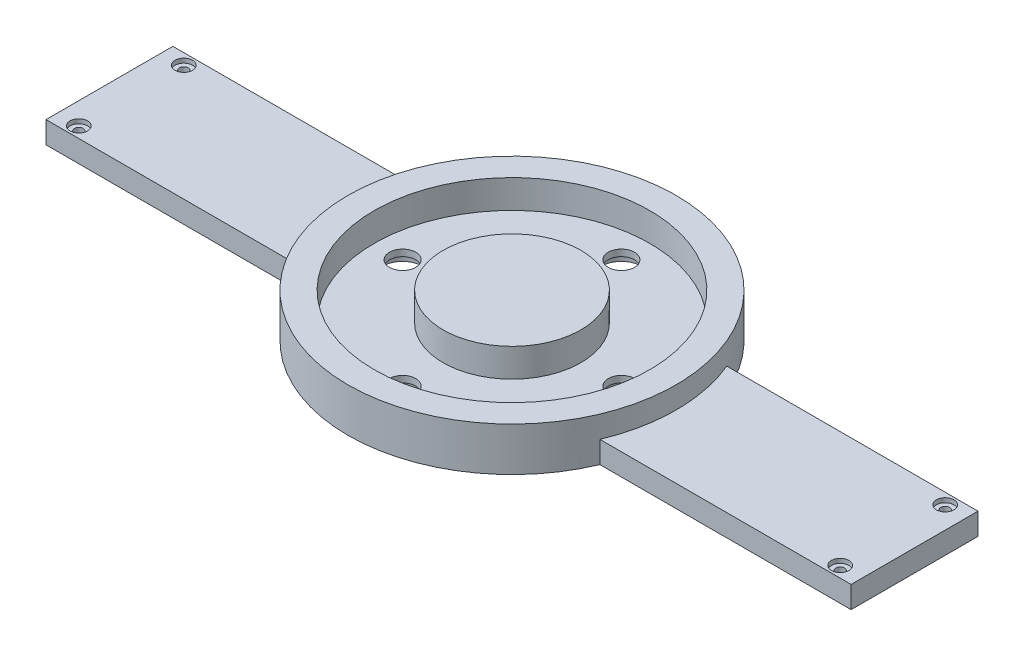
ISO-10303-21;
HEADER;
FILE_DESCRIPTION(('STEP AP214'),'2;1');
FILE_NAME('part.step','',(''),(''),'','','');
FILE_SCHEMA(('AUTOMOTIVE_DESIGN { 1 0 10303 214 1 1 1 1 }'));
ENDSEC;
DATA;
#1=APPLICATION_CONTEXT('core data for automotive mechanical design processes');
#2=APPLICATION_PROTOCOL_DEFINITION('international standard','automotive_design',2000,#1);
#3=PRODUCT_CONTEXT('',#1,'mechanical');
#4=PRODUCT('Part','Part','',(#3));
#5=PRODUCT_RELATED_PRODUCT_CATEGORY('part','',(#4));
#6=PRODUCT_DEFINITION_FORMATION('','',#4);
#7=PRODUCT_DEFINITION_CONTEXT('part definition',#1,'design');
#8=PRODUCT_DEFINITION('design','',#6,#7);
#9=PRODUCT_DEFINITION_SHAPE('','',#8);
#10=(LENGTH_UNIT() NAMED_UNIT(*) SI_UNIT(.MILLI.,.METRE.));
#11=(NAMED_UNIT(*) PLANE_ANGLE_UNIT() SI_UNIT($,.RADIAN.));
#12=(NAMED_UNIT(*) SI_UNIT($,.STERADIAN.) SOLID_ANGLE_UNIT());
#13=UNCERTAINTY_MEASURE_WITH_UNIT(LENGTH_MEASURE(1.E-05),#10,'distance_accuracy_value','');
#14=(GEOMETRIC_REPRESENTATION_CONTEXT(3) GLOBAL_UNCERTAINTY_ASSIGNED_CONTEXT((#13)) GLOBAL_UNIT_ASSIGNED_CONTEXT((#10,
#11,#12)) REPRESENTATION_CONTEXT('',''));
#15=CARTESIAN_POINT('',(0.,0.,0.));
#16=DIRECTION('',(0.,0.,1.));
#17=DIRECTION('',(1.,0.,0.));
#18=AXIS2_PLACEMENT_3D('',#15,#16,#17);
#19=CARTESIAN_POINT('',(-87.,5.,-12.));
#20=DIRECTION('',(0.,-1.,0.));
#21=DIRECTION('',(0.,0.,-1.));
#22=AXIS2_PLACEMENT_3D('',#19,#20,#21);
#23=CYLINDRICAL_SURFACE('',#22,0.999999999999998);
#24=CARTESIAN_POINT('',(-87.,0.,-12.));
#25=DIRECTION('',(0.,-1.,0.));
#26=DIRECTION('',(0.,0.,-1.));
#27=AXIS2_PLACEMENT_3D('',#24,#25,#26);
#28=CIRCLE('',#27,0.999999999999998);
#29=CARTESIAN_POINT('',(-87.,0.,-13.));
#30=VERTEX_POINT('',#29);
#31=EDGE_CURVE('E254',#30,#30,#28,.T.);
#32=ORIENTED_EDGE('',*,*,#31,.T.);
#33=EDGE_LOOP('',(#32));
#34=FACE_BOUND('',#33,.T.);
#35=CARTESIAN_POINT('',(-87.,4.,-12.));
#36=DIRECTION('',(0.,1.,0.));
#37=DIRECTION('',(0.,0.,1.));
#38=AXIS2_PLACEMENT_3D('',#35,#36,#37);
#39=CIRCLE('',#38,0.999999999999998);
#40=CARTESIAN_POINT('',(-87.,4.,-11.));
#41=VERTEX_POINT('',#40);
#42=EDGE_CURVE('E45',#41,#41,#39,.F.);
#43=ORIENTED_EDGE('',*,*,#42,.F.);
#44=EDGE_LOOP('',(#43));
#45=FACE_BOUND('',#44,.T.);
#46=ADVANCED_FACE('F41',(#34,#45),#23,.F.);
#47=CARTESIAN_POINT('',(-87.,5.,12.));
#48=DIRECTION('',(0.,-1.,0.));
#49=DIRECTION('',(0.,0.,-1.));
#50=AXIS2_PLACEMENT_3D('',#47,#48,#49);
#51=CYLINDRICAL_SURFACE('',#50,0.999999999999998);
#52=CARTESIAN_POINT('',(-87.,0.,12.));
#53=DIRECTION('',(0.,-1.,0.));
#54=DIRECTION('',(0.,0.,-1.));
#55=AXIS2_PLACEMENT_3D('',#52,#53,#54);
#56=CIRCLE('',#55,0.999999999999998);
#57=CARTESIAN_POINT('',(-87.,0.,11.));
#58=VERTEX_POINT('',#57);
#59=EDGE_CURVE('E285',#58,#58,#56,.T.);
#60=ORIENTED_EDGE('',*,*,#59,.T.);
#61=EDGE_LOOP('',(#60));
#62=FACE_BOUND('',#61,.T.);
#63=CARTESIAN_POINT('',(-87.,4.,12.));
#64=DIRECTION('',(0.,1.,0.));
#65=DIRECTION('',(0.,0.,1.));
#66=AXIS2_PLACEMENT_3D('',#63,#64,#65);
#67=CIRCLE('',#66,0.999999999999998);
#68=CARTESIAN_POINT('',(-87.,4.,13.));
#69=VERTEX_POINT('',#68);
#70=EDGE_CURVE('E259',#69,#69,#67,.F.);
#71=ORIENTED_EDGE('',*,*,#70,.F.);
#72=EDGE_LOOP('',(#71));
#73=FACE_BOUND('',#72,.T.);
#74=ADVANCED_FACE('F366',(#62,#73),#51,.F.);
#75=CARTESIAN_POINT('',(87.,5.,-12.));
#76=DIRECTION('',(0.,-1.,0.));
#77=DIRECTION('',(0.,0.,-1.));
#78=AXIS2_PLACEMENT_3D('',#75,#76,#77);
#79=CYLINDRICAL_SURFACE('',#78,0.999999999999998);
#80=CARTESIAN_POINT('',(87.,0.,-12.));
#81=DIRECTION('',(0.,-1.,0.));
#82=DIRECTION('',(0.,0.,-1.));
#83=AXIS2_PLACEMENT_3D('',#80,#81,#82);
#84=CIRCLE('',#83,0.999999999999998);
#85=CARTESIAN_POINT('',(87.,0.,-13.));
#86=VERTEX_POINT('',#85);
#87=EDGE_CURVE('E280',#86,#86,#84,.T.);
#88=ORIENTED_EDGE('',*,*,#87,.T.);
#89=EDGE_LOOP('',(#88));
#90=FACE_BOUND('',#89,.T.);
#91=CARTESIAN_POINT('',(87.,4.,-12.));
#92=DIRECTION('',(0.,1.,0.));
#93=DIRECTION('',(0.,0.,1.));
#94=AXIS2_PLACEMENT_3D('',#91,#92,#93);
#95=CIRCLE('',#94,0.999999999999998);
#96=CARTESIAN_POINT('',(87.,4.,-11.));
#97=VERTEX_POINT('',#96);
#98=EDGE_CURVE('E256',#97,#97,#95,.F.);
#99=ORIENTED_EDGE('',*,*,#98,.F.);
#100=EDGE_LOOP('',(#99));
#101=FACE_BOUND('',#100,.T.);
#102=ADVANCED_FACE('F372',(#90,#101),#79,.F.);
#103=CARTESIAN_POINT('',(87.,5.,12.));
#104=DIRECTION('',(0.,-1.,0.));
#105=DIRECTION('',(0.,0.,-1.));
#106=AXIS2_PLACEMENT_3D('',#103,#104,#105);
#107=CYLINDRICAL_SURFACE('',#106,0.999999999999998);
#108=CARTESIAN_POINT('',(87.,0.,12.));
#109=DIRECTION('',(0.,-1.,0.));
#110=DIRECTION('',(0.,0.,-1.));
#111=AXIS2_PLACEMENT_3D('',#108,#109,#110);
#112=CIRCLE('',#111,0.999999999999998);
#113=CARTESIAN_POINT('',(87.,0.,11.));
#114=VERTEX_POINT('',#113);
#115=EDGE_CURVE('E284',#114,#114,#112,.T.);
#116=ORIENTED_EDGE('',*,*,#115,.T.);
#117=EDGE_LOOP('',(#116));
#118=FACE_BOUND('',#117,.T.);
#119=CARTESIAN_POINT('',(87.,4.,12.));
#120=DIRECTION('',(0.,1.,0.));
#121=DIRECTION('',(0.,0.,1.));
#122=AXIS2_PLACEMENT_3D('',#119,#120,#121);
#123=CIRCLE('',#122,0.999999999999998);
#124=CARTESIAN_POINT('',(87.,4.,13.));
#125=VERTEX_POINT('',#124);
#126=EDGE_CURVE('E250',#125,#125,#123,.F.);
#127=ORIENTED_EDGE('',*,*,#126,.F.);
#128=EDGE_LOOP('',(#127));
#129=FACE_BOUND('',#128,.T.);
#130=ADVANCED_FACE('F378',(#118,#129),#107,.F.);
#131=CARTESIAN_POINT('',(0.,3.5,25.));
#132=DIRECTION('',(0.,-1.,0.));
#133=DIRECTION('',(0.,0.,-1.));
#134=AXIS2_PLACEMENT_3D('',#131,#132,#133);
#135=CYLINDRICAL_SURFACE('',#134,3.);
#136=CARTESIAN_POINT('',(0.,3.5,25.));
#137=DIRECTION('',(0.,-1.,0.));
#138=DIRECTION('',(0.,0.,-1.));
#139=AXIS2_PLACEMENT_3D('',#136,#137,#138);
#140=CIRCLE('',#139,3.);
#141=CARTESIAN_POINT('',(0.,3.5,22.));
#142=VERTEX_POINT('',#141);
#143=EDGE_CURVE('E202',#142,#142,#140,.T.);
#144=ORIENTED_EDGE('',*,*,#143,.F.);
#145=EDGE_LOOP('',(#144));
#146=FACE_BOUND('',#145,.T.);
#147=CARTESIAN_POINT('',(0.,2.,25.));
#148=DIRECTION('',(0.,-1.,0.));
#149=DIRECTION('',(0.,0.,-1.));
#150=AXIS2_PLACEMENT_3D('',#147,#148,#149);
#151=CIRCLE('',#150,3.);
#152=CARTESIAN_POINT('',(0.,2.,22.));
#153=VERTEX_POINT('',#152);
#154=EDGE_CURVE('E245',#153,#153,#151,.F.);
#155=ORIENTED_EDGE('',*,*,#154,.F.);
#156=EDGE_LOOP('',(#155));
#157=FACE_BOUND('',#156,.T.);
#158=ADVANCED_FACE('F381',(#146,#157),#135,.F.);
#159=CARTESIAN_POINT('',(-25.,3.5,2.61861100413235E-13));
#160=DIRECTION('',(0.,-1.,0.));
#161=DIRECTION('',(0.,0.,-1.));
#162=AXIS2_PLACEMENT_3D('',#159,#160,#161);
#163=CYLINDRICAL_SURFACE('',#162,3.);
#164=CARTESIAN_POINT('',(-25.,3.5,2.61861100413235E-13));
#165=DIRECTION('',(0.,-1.,0.));
#166=DIRECTION('',(1.,0.,0.));
#167=AXIS2_PLACEMENT_3D('',#164,#165,#166);
#168=CIRCLE('',#167,3.);
#169=CARTESIAN_POINT('',(-22.,3.5,2.30437768363647E-13));
#170=VERTEX_POINT('',#169);
#171=EDGE_CURVE('E188',#170,#170,#168,.T.);
#172=ORIENTED_EDGE('',*,*,#171,.F.);
#173=EDGE_LOOP('',(#172));
#174=FACE_BOUND('',#173,.T.);
#175=CARTESIAN_POINT('',(-25.,2.,2.61861100413235E-13));
#176=DIRECTION('',(0.,-1.,0.));
#177=DIRECTION('',(0.,0.,-1.));
#178=AXIS2_PLACEMENT_3D('',#175,#176,#177);
#179=CIRCLE('',#178,3.);
#180=CARTESIAN_POINT('',(-25.,2.,-2.99999999999974));
#181=VERTEX_POINT('',#180);
#182=EDGE_CURVE('E240',#181,#181,#179,.F.);
#183=ORIENTED_EDGE('',*,*,#182,.F.);
#184=EDGE_LOOP('',(#183));
#185=FACE_BOUND('',#184,.T.);
#186=ADVANCED_FACE('F583',(#174,#185),#163,.F.);
#187=CARTESIAN_POINT('',(0.,3.5,-25.));
#188=DIRECTION('',(0.,-1.,0.));
#189=DIRECTION('',(0.,0.,-1.));
#190=AXIS2_PLACEMENT_3D('',#187,#188,#189);
#191=CYLINDRICAL_SURFACE('',#190,3.);
#192=CARTESIAN_POINT('',(0.,3.5,-25.));
#193=DIRECTION('',(0.,-1.,0.));
#194=DIRECTION('',(0.,0.,1.));
#195=AXIS2_PLACEMENT_3D('',#192,#193,#194);
#196=CIRCLE('',#195,3.);
#197=CARTESIAN_POINT('',(0.,3.5,-22.));
#198=VERTEX_POINT('',#197);
#199=EDGE_CURVE('E203',#198,#198,#196,.T.);
#200=ORIENTED_EDGE('',*,*,#199,.F.);
#201=EDGE_LOOP('',(#200));
#202=FACE_BOUND('',#201,.T.);
#203=CARTESIAN_POINT('',(0.,2.,-25.));
#204=DIRECTION('',(0.,-1.,0.));
#205=DIRECTION('',(0.,0.,-1.));
#206=AXIS2_PLACEMENT_3D('',#203,#204,#205);
#207=CIRCLE('',#206,3.);
#208=CARTESIAN_POINT('',(0.,2.,-28.));
#209=VERTEX_POINT('',#208);
#210=EDGE_CURVE('E236',#209,#209,#207,.F.);
#211=ORIENTED_EDGE('',*,*,#210,.F.);
#212=EDGE_LOOP('',(#211));
#213=FACE_BOUND('',#212,.T.);
#214=ADVANCED_FACE('F592',(#202,#213),#191,.F.);
#215=CARTESIAN_POINT('',(25.,3.5,0.));
#216=DIRECTION('',(0.,-1.,0.));
#217=DIRECTION('',(0.,0.,-1.));
#218=AXIS2_PLACEMENT_3D('',#215,#216,#217);
#219=CYLINDRICAL_SURFACE('',#218,3.);
#220=CARTESIAN_POINT('',(25.,3.5,0.));
#221=DIRECTION('',(0.,-1.,0.));
#222=DIRECTION('',(-1.,0.,0.));
#223=AXIS2_PLACEMENT_3D('',#220,#221,#222);
#224=CIRCLE('',#223,3.);
#225=CARTESIAN_POINT('',(22.,3.5,0.));
#226=VERTEX_POINT('',#225);
#227=EDGE_CURVE('E198',#226,#226,#224,.T.);
#228=ORIENTED_EDGE('',*,*,#227,.F.);
#229=EDGE_LOOP('',(#228));
#230=FACE_BOUND('',#229,.T.);
#231=CARTESIAN_POINT('',(25.,2.,0.));
#232=DIRECTION('',(0.,-1.,0.));
#233=DIRECTION('',(0.,0.,-1.));
#234=AXIS2_PLACEMENT_3D('',#231,#232,#233);
#235=CIRCLE('',#234,3.);
#236=CARTESIAN_POINT('',(25.,2.,-3.00000000000009));
#237=VERTEX_POINT('',#236);
#238=EDGE_CURVE('E144',#237,#237,#235,.F.);
#239=ORIENTED_EDGE('',*,*,#238,.F.);
#240=EDGE_LOOP('',(#239));
#241=FACE_BOUND('',#240,.T.);
#242=ADVANCED_FACE('F599',(#230,#241),#219,.F.);
#243=CARTESIAN_POINT('',(0.,10.,0.));
#244=DIRECTION('',(0.,-1.,0.));
#245=DIRECTION('',(0.,0.,-1.));
#246=AXIS2_PLACEMENT_3D('',#243,#244,#245);
#247=CYLINDRICAL_SURFACE('',#246,37.5);
#248=CARTESIAN_POINT('',(0.,0.,0.));
#249=DIRECTION('',(0.,1.,0.));
#250=DIRECTION('',(0.,0.,1.));
#251=AXIS2_PLACEMENT_3D('',#248,#249,#250);
#252=CIRCLE('',#251,37.5);
#253=CARTESIAN_POINT('',(34.5832329315812,0.,-14.5));
#254=VERTEX_POINT('',#253);
#255=CARTESIAN_POINT('',(-34.5832329315812,0.,-14.5));
#256=VERTEX_POINT('',#255);
#257=EDGE_CURVE('E51',#254,#256,#252,.T.);
#258=ORIENTED_EDGE('',*,*,#257,.T.);
#259=DIRECTION('',(0.,-1.,0.));
#260=VECTOR('',#259,1.);
#261=CARTESIAN_POINT('',(-34.5832329315812,5.,-14.5));
#262=LINE('',#261,#260);
#263=CARTESIAN_POINT('',(-34.5832329315812,5.,-14.5));
#264=VERTEX_POINT('',#263);
#265=EDGE_CURVE('E59',#264,#256,#262,.T.);
#266=ORIENTED_EDGE('',*,*,#265,.F.);
#267=CARTESIAN_POINT('',(0.,5.,0.));
#268=DIRECTION('',(0.,1.,0.));
#269=DIRECTION('',(0.,0.,1.));
#270=AXIS2_PLACEMENT_3D('',#267,#268,#269);
#271=CIRCLE('',#270,37.5);
#272=CARTESIAN_POINT('',(-34.5832329315812,5.,14.5));
#273=VERTEX_POINT('',#272);
#274=EDGE_CURVE('E63',#264,#273,#271,.T.);
#275=ORIENTED_EDGE('',*,*,#274,.T.);
#276=DIRECTION('',(0.,-1.,0.));
#277=VECTOR('',#276,1.);
#278=CARTESIAN_POINT('',(-34.5832329315812,5.,14.5));
#279=LINE('',#278,#277);
#280=CARTESIAN_POINT('',(-34.5832329315812,0.,14.5));
#281=VERTEX_POINT('',#280);
#282=EDGE_CURVE('E121',#273,#281,#279,.T.);
#283=ORIENTED_EDGE('',*,*,#282,.T.);
#284=CARTESIAN_POINT('',(34.5832329315812,0.,14.5));
#285=VERTEX_POINT('',#284);
#286=EDGE_CURVE('E226',#281,#285,#252,.T.);
#287=ORIENTED_EDGE('',*,*,#286,.T.);
#288=DIRECTION('',(0.,-1.,0.));
#289=VECTOR('',#288,1.);
#290=CARTESIAN_POINT('',(34.5832329315812,5.,14.5));
#291=LINE('',#290,#289);
#292=CARTESIAN_POINT('',(34.5832329315812,5.,14.5));
#293=VERTEX_POINT('',#292);
#294=EDGE_CURVE('E184',#293,#285,#291,.T.);
#295=ORIENTED_EDGE('',*,*,#294,.F.);
#296=CARTESIAN_POINT('',(0.,5.,0.));
#297=DIRECTION('',(0.,1.,0.));
#298=DIRECTION('',(0.,0.,-1.));
#299=AXIS2_PLACEMENT_3D('',#296,#297,#298);
#300=CIRCLE('',#299,37.5);
#301=CARTESIAN_POINT('',(34.5832329315812,5.,-14.5));
#302=VERTEX_POINT('',#301);
#303=EDGE_CURVE('E157',#293,#302,#300,.T.);
#304=ORIENTED_EDGE('',*,*,#303,.T.);
#305=DIRECTION('',(0.,-1.,0.));
#306=VECTOR('',#305,1.);
#307=CARTESIAN_POINT('',(34.5832329315812,5.,-14.5));
#308=LINE('',#307,#306);
#309=EDGE_CURVE('E173',#302,#254,#308,.T.);
#310=ORIENTED_EDGE('',*,*,#309,.T.);
#311=EDGE_LOOP('',(#258,#266,#275,#283,#287,#295,#304,#310));
#312=FACE_BOUND('',#311,.T.);
#313=CARTESIAN_POINT('',(0.,10.,0.));
#314=DIRECTION('',(0.,1.,0.));
#315=DIRECTION('',(0.,0.,1.));
#316=AXIS2_PLACEMENT_3D('',#313,#314,#315);
#317=CIRCLE('',#316,37.5);
#318=CARTESIAN_POINT('',(0.,10.,37.5));
#319=VERTEX_POINT('',#318);
#320=EDGE_CURVE('E11',#319,#319,#317,.T.);
#321=ORIENTED_EDGE('',*,*,#320,.F.);
#322=EDGE_LOOP('',(#321));
#323=FACE_BOUND('',#322,.T.);
#324=ADVANCED_FACE('F43',(#312,#323),#247,.T.);
#325=CARTESIAN_POINT('',(0.,10.,0.));
#326=DIRECTION('',(0.,1.,0.));
#327=DIRECTION('',(0.,0.,1.));
#328=AXIS2_PLACEMENT_3D('',#325,#326,#327);
#329=PLANE('',#328);
#330=CARTESIAN_POINT('',(0.,10.,0.));
#331=DIRECTION('',(0.,1.,0.));
#332=DIRECTION('',(0.,0.,1.));
#333=AXIS2_PLACEMENT_3D('',#330,#331,#332);
#334=CIRCLE('',#333,31.5);
#335=CARTESIAN_POINT('',(0.,10.,31.5));
#336=VERTEX_POINT('',#335);
#337=EDGE_CURVE('E218',#336,#336,#334,.T.);
#338=ORIENTED_EDGE('',*,*,#337,.F.);
#339=EDGE_LOOP('',(#338));
#340=FACE_BOUND('',#339,.T.);
#341=ORIENTED_EDGE('',*,*,#320,.T.);
#342=EDGE_LOOP('',(#341));
#343=FACE_BOUND('',#342,.T.);
#344=ADVANCED_FACE('F330',(#340,#343),#329,.T.);
#345=CARTESIAN_POINT('',(0.,0.,0.));
#346=DIRECTION('',(0.,1.,0.));
#347=DIRECTION('',(0.,0.,1.));
#348=AXIS2_PLACEMENT_3D('',#345,#346,#347);
#349=PLANE('',#348);
#350=ORIENTED_EDGE('',*,*,#87,.F.);
#351=EDGE_LOOP('',(#350));
#352=FACE_BOUND('',#351,.T.);
#353=ORIENTED_EDGE('',*,*,#59,.F.);
#354=EDGE_LOOP('',(#353));
#355=FACE_BOUND('',#354,.T.);
#356=ORIENTED_EDGE('',*,*,#31,.F.);
#357=EDGE_LOOP('',(#356));
#358=FACE_BOUND('',#357,.T.);
#359=ORIENTED_EDGE('',*,*,#115,.F.);
#360=EDGE_LOOP('',(#359));
#361=FACE_BOUND('',#360,.T.);
#362=CARTESIAN_POINT('',(-1.74574066942157E-13,0.,-25.));
#363=DIRECTION('',(0.,-1.,0.));
#364=DIRECTION('',(-1.,0.,0.));
#365=AXIS2_PLACEMENT_3D('',#362,#363,#364);
#366=CIRCLE('',#365,4.5);
#367=CARTESIAN_POINT('',(-4.50000000000018,0.,-25.));
#368=VERTEX_POINT('',#367);
#369=EDGE_CURVE('E299',#368,#368,#366,.T.);
#370=ORIENTED_EDGE('',*,*,#369,.F.);
#371=EDGE_LOOP('',(#370));
#372=FACE_BOUND('',#371,.T.);
#373=CARTESIAN_POINT('',(-25.,0.,0.));
#374=DIRECTION('',(0.,-1.,0.));
#375=DIRECTION('',(0.,0.,1.));
#376=AXIS2_PLACEMENT_3D('',#373,#374,#375);
#377=CIRCLE('',#376,4.5);
#378=CARTESIAN_POINT('',(-25.,0.,4.50000000000009));
#379=VERTEX_POINT('',#378);
#380=EDGE_CURVE('E307',#379,#379,#377,.T.);
#381=ORIENTED_EDGE('',*,*,#380,.F.);
#382=EDGE_LOOP('',(#381));
#383=FACE_BOUND('',#382,.T.);
#384=CARTESIAN_POINT('',(3.49148133884313E-13,0.,25.));
#385=DIRECTION('',(0.,-1.,0.));
#386=DIRECTION('',(1.,0.,0.));
#387=AXIS2_PLACEMENT_3D('',#384,#385,#386);
#388=CIRCLE('',#387,4.5);
#389=CARTESIAN_POINT('',(4.50000000000035,0.,25.));
#390=VERTEX_POINT('',#389);
#391=EDGE_CURVE('E295',#390,#390,#388,.T.);
#392=ORIENTED_EDGE('',*,*,#391,.F.);
#393=EDGE_LOOP('',(#392));
#394=FACE_BOUND('',#393,.T.);
#395=CARTESIAN_POINT('',(25.,0.,0.));
#396=DIRECTION('',(0.,-1.,0.));
#397=DIRECTION('',(0.,0.,-1.));
#398=AXIS2_PLACEMENT_3D('',#395,#396,#397);
#399=CIRCLE('',#398,4.5);
#400=CARTESIAN_POINT('',(25.,0.,-4.50000000000009));
#401=VERTEX_POINT('',#400);
#402=EDGE_CURVE('E249',#401,#401,#399,.T.);
#403=ORIENTED_EDGE('',*,*,#402,.F.);
#404=EDGE_LOOP('',(#403));
#405=FACE_BOUND('',#404,.T.);
#406=ORIENTED_EDGE('',*,*,#257,.F.);
#407=DIRECTION('',(1.,0.,0.));
#408=VECTOR('',#407,1.);
#409=CARTESIAN_POINT('',(34.5832329315812,0.,-14.5));
#410=LINE('',#409,#408);
#411=CARTESIAN_POINT('',(92.0000000015812,0.,-14.5));
#412=VERTEX_POINT('',#411);
#413=EDGE_CURVE('E152',#254,#412,#410,.T.);
#414=ORIENTED_EDGE('',*,*,#413,.T.);
#415=DIRECTION('',(0.,0.,1.));
#416=VECTOR('',#415,1.);
#417=CARTESIAN_POINT('',(92.0000000015812,0.,-14.5));
#418=LINE('',#417,#416);
#419=CARTESIAN_POINT('',(92.0000000015812,0.,14.5));
#420=VERTEX_POINT('',#419);
#421=EDGE_CURVE('E177',#412,#420,#418,.T.);
#422=ORIENTED_EDGE('',*,*,#421,.T.);
#423=DIRECTION('',(-1.,0.,0.));
#424=VECTOR('',#423,1.);
#425=CARTESIAN_POINT('',(34.5832329315812,0.,14.5));
#426=LINE('',#425,#424);
#427=EDGE_CURVE('E161',#420,#285,#426,.T.);
#428=ORIENTED_EDGE('',*,*,#427,.T.);
#429=ORIENTED_EDGE('',*,*,#286,.F.);
#430=DIRECTION('',(-1.,0.,0.));
#431=VECTOR('',#430,1.);
#432=CARTESIAN_POINT('',(-34.5832329315812,0.,14.5));
#433=LINE('',#432,#431);
#434=CARTESIAN_POINT('',(-92.0000000015812,0.,14.5));
#435=VERTEX_POINT('',#434);
#436=EDGE_CURVE('E141',#281,#435,#433,.T.);
#437=ORIENTED_EDGE('',*,*,#436,.T.);
#438=DIRECTION('',(0.,0.,-1.));
#439=VECTOR('',#438,1.);
#440=CARTESIAN_POINT('',(-92.0000000015812,0.,14.5));
#441=LINE('',#440,#439);
#442=CARTESIAN_POINT('',(-92.0000000015812,0.,-14.5));
#443=VERTEX_POINT('',#442);
#444=EDGE_CURVE('E114',#435,#443,#441,.T.);
#445=ORIENTED_EDGE('',*,*,#444,.T.);
#446=DIRECTION('',(1.,0.,0.));
#447=VECTOR('',#446,1.);
#448=CARTESIAN_POINT('',(-34.5832329315812,0.,-14.5));
#449=LINE('',#448,#447);
#450=EDGE_CURVE('E135',#443,#256,#449,.T.);
#451=ORIENTED_EDGE('',*,*,#450,.T.);
#452=EDGE_LOOP('',(#406,#414,#422,#428,#429,#437,#445,#451));
#453=FACE_BOUND('',#452,.T.);
#454=ADVANCED_FACE('F326',(#352,#355,#358,#361,#372,#383,#394,#405,#453),#349,.F.);
#455=CARTESIAN_POINT('',(0.,3.5,0.));
#456=DIRECTION('',(0.,1.,0.));
#457=DIRECTION('',(0.,0.,1.));
#458=AXIS2_PLACEMENT_3D('',#455,#456,#457);
#459=CYLINDRICAL_SURFACE('',#458,31.5);
#460=CARTESIAN_POINT('',(0.,3.5,0.));
#461=DIRECTION('',(0.,1.,0.));
#462=DIRECTION('',(0.,0.,1.));
#463=AXIS2_PLACEMENT_3D('',#460,#461,#462);
#464=CIRCLE('',#463,31.5);
#465=CARTESIAN_POINT('',(0.,3.5,31.5));
#466=VERTEX_POINT('',#465);
#467=EDGE_CURVE('E222',#466,#466,#464,.T.);
#468=CARTESIAN_POINT('',(0.,3.5,31.5));
#469=CARTESIAN_POINT('',(0.,3.56770833333333,31.5));
#470=CARTESIAN_POINT('',(0.,3.63541666666667,31.5));
#471=CARTESIAN_POINT('',(0.,3.77083333333333,31.5));
#472=CARTESIAN_POINT('',(0.,3.83854166666667,31.5));
#473=CARTESIAN_POINT('',(0.,3.97395833333333,31.5));
#474=CARTESIAN_POINT('',(0.,4.04166666666667,31.5));
#475=CARTESIAN_POINT('',(0.,4.17708333333333,31.5));
#476=CARTESIAN_POINT('',(0.,4.24479166666667,31.5));
#477=CARTESIAN_POINT('',(0.,4.38020833333333,31.5));
#478=CARTESIAN_POINT('',(0.,4.44791666666667,31.5));
#479=CARTESIAN_POINT('',(0.,4.58333333333333,31.5));
#480=CARTESIAN_POINT('',(0.,4.65104166666667,31.5));
#481=CARTESIAN_POINT('',(0.,4.78645833333333,31.5));
#482=CARTESIAN_POINT('',(0.,4.85416666666667,31.5));
#483=CARTESIAN_POINT('',(0.,4.98958333333333,31.5));
#484=CARTESIAN_POINT('',(0.,5.05729166666667,31.5));
#485=CARTESIAN_POINT('',(0.,5.19270833333333,31.5));
#486=CARTESIAN_POINT('',(0.,5.26041666666667,31.5));
#487=CARTESIAN_POINT('',(0.,5.39583333333333,31.5));
#488=CARTESIAN_POINT('',(0.,5.46354166666667,31.5));
#489=CARTESIAN_POINT('',(0.,5.59895833333333,31.5));
#490=CARTESIAN_POINT('',(0.,5.66666666666667,31.5));
#491=CARTESIAN_POINT('',(0.,5.80208333333333,31.5));
#492=CARTESIAN_POINT('',(0.,5.86979166666667,31.5));
#493=CARTESIAN_POINT('',(0.,6.00520833333333,31.5));
#494=CARTESIAN_POINT('',(0.,6.07291666666667,31.5));
#495=CARTESIAN_POINT('',(0.,6.20833333333333,31.5));
#496=CARTESIAN_POINT('',(0.,6.27604166666667,31.5));
#497=CARTESIAN_POINT('',(0.,6.41145833333333,31.5));
#498=CARTESIAN_POINT('',(0.,6.47916666666667,31.5));
#499=CARTESIAN_POINT('',(0.,6.61458333333333,31.5));
#500=CARTESIAN_POINT('',(0.,6.68229166666667,31.5));
#501=CARTESIAN_POINT('',(0.,6.81770833333333,31.5));
#502=CARTESIAN_POINT('',(0.,6.88541666666667,31.5));
#503=CARTESIAN_POINT('',(0.,7.02083333333333,31.5));
#504=CARTESIAN_POINT('',(0.,7.08854166666667,31.5));
#505=CARTESIAN_POINT('',(0.,7.22395833333333,31.5));
#506=CARTESIAN_POINT('',(0.,7.29166666666667,31.5));
#507=CARTESIAN_POINT('',(0.,7.42708333333333,31.5));
#508=CARTESIAN_POINT('',(0.,7.49479166666667,31.5));
#509=CARTESIAN_POINT('',(0.,7.63020833333333,31.5));
#510=CARTESIAN_POINT('',(0.,7.69791666666667,31.5));
#511=CARTESIAN_POINT('',(0.,7.83333333333333,31.5));
#512=CARTESIAN_POINT('',(0.,7.90104166666667,31.5));
#513=CARTESIAN_POINT('',(0.,8.03645833333333,31.5));
#514=CARTESIAN_POINT('',(0.,8.10416666666667,31.5));
#515=CARTESIAN_POINT('',(0.,8.23958333333333,31.5));
#516=CARTESIAN_POINT('',(0.,8.30729166666667,31.5));
#517=CARTESIAN_POINT('',(0.,8.44270833333333,31.5));
#518=CARTESIAN_POINT('',(0.,8.51041666666667,31.5));
#519=CARTESIAN_POINT('',(0.,8.64583333333333,31.5));
#520=CARTESIAN_POINT('',(0.,8.71354166666667,31.5));
#521=CARTESIAN_POINT('',(0.,8.84895833333333,31.5));
#522=CARTESIAN_POINT('',(0.,8.91666666666667,31.5));
#523=CARTESIAN_POINT('',(0.,9.05208333333333,31.5));
#524=CARTESIAN_POINT('',(0.,9.11979166666667,31.5));
#525=CARTESIAN_POINT('',(0.,9.25520833333333,31.5));
#526=CARTESIAN_POINT('',(0.,9.32291666666667,31.5));
#527=CARTESIAN_POINT('',(0.,9.45833333333333,31.5));
#528=CARTESIAN_POINT('',(0.,9.52604166666667,31.5));
#529=CARTESIAN_POINT('',(0.,9.66145833333333,31.5));
#530=CARTESIAN_POINT('',(0.,9.72916666666667,31.5));
#531=CARTESIAN_POINT('',(0.,9.86458333333333,31.5));
#532=CARTESIAN_POINT('',(0.,9.93229166666667,31.5));
#533=CARTESIAN_POINT('',(0.,10.,31.5));
#534=B_SPLINE_CURVE_WITH_KNOTS('',3,(#468,#469,#470,#471,#472,#473,#474,#475,#476,#477,#478,
#479,#480,#481,#482,#483,#484,#485,#486,#487,#488,#489,#490,#491,#492,#493,#494,#495,#496,#497,
#498,#499,#500,#501,#502,#503,#504,#505,#506,#507,#508,#509,#510,#511,#512,#513,#514,#515,#516,
#517,#518,#519,#520,#521,#522,#523,#524,#525,#526,#527,#528,#529,#530,#531,#532,#533),
.UNSPECIFIED.,.F.,.F.,(4,2,2,2,2,2,2,2,2,2,2,2,2,2,2,2,2,2,2,2,2,2,2,2,2,2,2,2,2,2,2,2,4),(0.,
0.203125,0.40625,0.609375,0.8125,1.015625,1.21875,1.421875,1.625,1.828125,2.03125,2.234375,
2.4375,2.640625,2.84375,3.046875,3.25,3.453125,3.65625,3.859375,4.0625,4.265625,4.46875,
4.671875,4.875,5.078125,5.28125,5.484375,5.6875,5.890625,6.09375,6.296875,6.5),.UNSPECIFIED.);
#535=EDGE_CURVE('BSEAM329',#466,#336,#534,.T.);
#536=ORIENTED_EDGE('',*,*,#467,.F.);
#537=ORIENTED_EDGE('',*,*,#337,.T.);
#538=ORIENTED_EDGE('',*,*,#535,.T.);
#539=ORIENTED_EDGE('',*,*,#535,.F.);
#540=EDGE_LOOP('',(#536,#538,#537,#539));
#541=FACE_BOUND('',#540,.T.);
#542=ADVANCED_FACE('F329',(#541),#459,.F.);
#543=CARTESIAN_POINT('',(0.,3.5,0.));
#544=DIRECTION('',(0.,1.,0.));
#545=DIRECTION('',(0.,0.,1.));
#546=AXIS2_PLACEMENT_3D('',#543,#544,#545);
#547=PLANE('',#546);
#548=ORIENTED_EDGE('',*,*,#227,.T.);
#549=EDGE_LOOP('',(#548));
#550=FACE_BOUND('',#549,.T.);
#551=ORIENTED_EDGE('',*,*,#199,.T.);
#552=EDGE_LOOP('',(#551));
#553=FACE_BOUND('',#552,.T.);
#554=ORIENTED_EDGE('',*,*,#171,.T.);
#555=EDGE_LOOP('',(#554));
#556=FACE_BOUND('',#555,.T.);
#557=ORIENTED_EDGE('',*,*,#143,.T.);
#558=EDGE_LOOP('',(#557));
#559=FACE_BOUND('',#558,.T.);
#560=CARTESIAN_POINT('',(0.,3.5,0.));
#561=DIRECTION('',(0.,1.,0.));
#562=DIRECTION('',(0.,0.,1.));
#563=AXIS2_PLACEMENT_3D('',#560,#561,#562);
#564=CIRCLE('',#563,15.75);
#565=CARTESIAN_POINT('',(0.,3.5,-15.75));
#566=VERTEX_POINT('',#565);
#567=EDGE_CURVE('E213',#566,#566,#564,.T.);
#568=ORIENTED_EDGE('',*,*,#567,.F.);
#569=EDGE_LOOP('',(#568));
#570=FACE_BOUND('',#569,.T.);
#571=ORIENTED_EDGE('',*,*,#467,.T.);
#572=EDGE_LOOP('',(#571));
#573=FACE_BOUND('',#572,.T.);
#574=ADVANCED_FACE('F663',(#550,#553,#556,#559,#570,#573),#547,.T.);
#575=CARTESIAN_POINT('',(0.,10.,0.));
#576=DIRECTION('',(0.,-1.,0.));
#577=DIRECTION('',(0.,0.,-1.));
#578=AXIS2_PLACEMENT_3D('',#575,#576,#577);
#579=CYLINDRICAL_SURFACE('',#578,15.75);
#580=CARTESIAN_POINT('',(0.,10.,0.));
#581=DIRECTION('',(0.,1.,0.));
#582=DIRECTION('',(0.,0.,1.));
#583=AXIS2_PLACEMENT_3D('',#580,#581,#582);
#584=CIRCLE('',#583,15.75);
#585=CARTESIAN_POINT('',(0.,10.,-15.75));
#586=VERTEX_POINT('',#585);
#587=EDGE_CURVE('E214',#586,#586,#584,.T.);
#588=CARTESIAN_POINT('',(0.,10.,-15.75));
#589=CARTESIAN_POINT('',(0.,9.93229166666667,-15.75));
#590=CARTESIAN_POINT('',(0.,9.86458333333333,-15.75));
#591=CARTESIAN_POINT('',(0.,9.72916666666667,-15.75));
#592=CARTESIAN_POINT('',(0.,9.66145833333333,-15.75));
#593=CARTESIAN_POINT('',(0.,9.52604166666667,-15.75));
#594=CARTESIAN_POINT('',(0.,9.45833333333333,-15.75));
#595=CARTESIAN_POINT('',(0.,9.32291666666667,-15.75));
#596=CARTESIAN_POINT('',(0.,9.25520833333333,-15.75));
#597=CARTESIAN_POINT('',(0.,9.11979166666667,-15.75));
#598=CARTESIAN_POINT('',(0.,9.05208333333333,-15.75));
#599=CARTESIAN_POINT('',(0.,8.91666666666667,-15.75));
#600=CARTESIAN_POINT('',(0.,8.84895833333333,-15.75));
#601=CARTESIAN_POINT('',(0.,8.71354166666667,-15.75));
#602=CARTESIAN_POINT('',(0.,8.64583333333333,-15.75));
#603=CARTESIAN_POINT('',(0.,8.51041666666667,-15.75));
#604=CARTESIAN_POINT('',(0.,8.44270833333333,-15.75));
#605=CARTESIAN_POINT('',(0.,8.30729166666667,-15.75));
#606=CARTESIAN_POINT('',(0.,8.23958333333333,-15.75));
#607=CARTESIAN_POINT('',(0.,8.10416666666667,-15.75));
#608=CARTESIAN_POINT('',(0.,8.03645833333333,-15.75));
#609=CARTESIAN_POINT('',(0.,7.90104166666667,-15.75));
#610=CARTESIAN_POINT('',(0.,7.83333333333333,-15.75));
#611=CARTESIAN_POINT('',(0.,7.69791666666667,-15.75));
#612=CARTESIAN_POINT('',(0.,7.63020833333333,-15.75));
#613=CARTESIAN_POINT('',(0.,7.49479166666667,-15.75));
#614=CARTESIAN_POINT('',(0.,7.42708333333333,-15.75));
#615=CARTESIAN_POINT('',(0.,7.29166666666667,-15.75));
#616=CARTESIAN_POINT('',(0.,7.22395833333333,-15.75));
#617=CARTESIAN_POINT('',(0.,7.08854166666667,-15.75));
#618=CARTESIAN_POINT('',(0.,7.02083333333333,-15.75));
#619=CARTESIAN_POINT('',(0.,6.88541666666667,-15.75));
#620=CARTESIAN_POINT('',(0.,6.81770833333333,-15.75));
#621=CARTESIAN_POINT('',(0.,6.68229166666667,-15.75));
#622=CARTESIAN_POINT('',(0.,6.61458333333333,-15.75));
#623=CARTESIAN_POINT('',(0.,6.47916666666667,-15.75));
#624=CARTESIAN_POINT('',(0.,6.41145833333333,-15.75));
#625=CARTESIAN_POINT('',(0.,6.27604166666667,-15.75));
#626=CARTESIAN_POINT('',(0.,6.20833333333333,-15.75));
#627=CARTESIAN_POINT('',(0.,6.07291666666667,-15.75));
#628=CARTESIAN_POINT('',(0.,6.00520833333333,-15.75));
#629=CARTESIAN_POINT('',(0.,5.86979166666667,-15.75));
#630=CARTESIAN_POINT('',(0.,5.80208333333333,-15.75));
#631=CARTESIAN_POINT('',(0.,5.66666666666667,-15.75));
#632=CARTESIAN_POINT('',(0.,5.59895833333333,-15.75));
#633=CARTESIAN_POINT('',(0.,5.46354166666667,-15.75));
#634=CARTESIAN_POINT('',(0.,5.39583333333333,-15.75));
#635=CARTESIAN_POINT('',(0.,5.26041666666667,-15.75));
#636=CARTESIAN_POINT('',(0.,5.19270833333333,-15.75));
#637=CARTESIAN_POINT('',(0.,5.05729166666667,-15.75));
#638=CARTESIAN_POINT('',(0.,4.98958333333333,-15.75));
#639=CARTESIAN_POINT('',(0.,4.85416666666667,-15.75));
#640=CARTESIAN_POINT('',(0.,4.78645833333333,-15.75));
#641=CARTESIAN_POINT('',(0.,4.65104166666667,-15.75));
#642=CARTESIAN_POINT('',(0.,4.58333333333333,-15.75));
#643=CARTESIAN_POINT('',(0.,4.44791666666667,-15.75));
#644=CARTESIAN_POINT('',(0.,4.38020833333333,-15.75));
#645=CARTESIAN_POINT('',(0.,4.24479166666667,-15.75));
#646=CARTESIAN_POINT('',(0.,4.17708333333333,-15.75));
#647=CARTESIAN_POINT('',(0.,4.04166666666667,-15.75));
#648=CARTESIAN_POINT('',(0.,3.97395833333333,-15.75));
#649=CARTESIAN_POINT('',(0.,3.83854166666667,-15.75));
#650=CARTESIAN_POINT('',(0.,3.77083333333333,-15.75));
#651=CARTESIAN_POINT('',(0.,3.63541666666667,-15.75));
#652=CARTESIAN_POINT('',(0.,3.56770833333333,-15.75));
#653=CARTESIAN_POINT('',(0.,3.5,-15.75));
#654=B_SPLINE_CURVE_WITH_KNOTS('',3,(#588,#589,#590,#591,#592,#593,#594,#595,#596,#597,#598,
#599,#600,#601,#602,#603,#604,#605,#606,#607,#608,#609,#610,#611,#612,#613,#614,#615,#616,#617,
#618,#619,#620,#621,#622,#623,#624,#625,#626,#627,#628,#629,#630,#631,#632,#633,#634,#635,#636,
#637,#638,#639,#640,#641,#642,#643,#644,#645,#646,#647,#648,#649,#650,#651,#652,#653),
.UNSPECIFIED.,.F.,.F.,(4,2,2,2,2,2,2,2,2,2,2,2,2,2,2,2,2,2,2,2,2,2,2,2,2,2,2,2,2,2,2,2,4),(0.,
0.203125,0.40625,0.609375000000001,0.812500000000001,1.015625,1.21875,1.421875,1.625,1.828125,
2.03125,2.234375,2.4375,2.640625,2.84375,3.046875,3.25,3.453125,3.65625,3.859375,4.0625,
4.265625,4.46875,4.671875,4.875,5.078125,5.28125,5.484375,5.6875,5.890625,6.09375,6.296875,6.5),.UNSPECIFIED.);
#655=EDGE_CURVE('BSEAM668',#586,#566,#654,.T.);
#656=ORIENTED_EDGE('',*,*,#587,.F.);
#657=ORIENTED_EDGE('',*,*,#567,.T.);
#658=ORIENTED_EDGE('',*,*,#655,.T.);
#659=ORIENTED_EDGE('',*,*,#655,.F.);
#660=EDGE_LOOP('',(#656,#658,#657,#659));
#661=FACE_BOUND('',#660,.T.);
#662=ADVANCED_FACE('F668',(#661),#579,.T.);
#663=CARTESIAN_POINT('',(0.,10.,0.));
#664=DIRECTION('',(0.,1.,0.));
#665=DIRECTION('',(0.,0.,1.));
#666=AXIS2_PLACEMENT_3D('',#663,#664,#665);
#667=PLANE('',#666);
#668=ORIENTED_EDGE('',*,*,#587,.T.);
#669=EDGE_LOOP('',(#668));
#670=FACE_BOUND('',#669,.T.);
#671=ADVANCED_FACE('F658',(#670),#667,.T.);
#672=CARTESIAN_POINT('',(34.5832329315812,5.,14.5));
#673=DIRECTION('',(0.,0.,1.));
#674=DIRECTION('',(1.,0.,0.));
#675=AXIS2_PLACEMENT_3D('',#672,#673,#674);
#676=PLANE('',#675);
#677=ORIENTED_EDGE('',*,*,#427,.F.);
#678=DIRECTION('',(0.,-1.,0.));
#679=VECTOR('',#678,1.);
#680=CARTESIAN_POINT('',(92.0000000015812,5.,14.5));
#681=LINE('',#680,#679);
#682=CARTESIAN_POINT('',(92.0000000015812,5.,14.5));
#683=VERTEX_POINT('',#682);
#684=EDGE_CURVE('E189',#683,#420,#681,.T.);
#685=ORIENTED_EDGE('',*,*,#684,.F.);
#686=DIRECTION('',(-1.,0.,0.));
#687=VECTOR('',#686,1.);
#688=CARTESIAN_POINT('',(34.5832329315812,5.,14.5));
#689=LINE('',#688,#687);
#690=EDGE_CURVE('E169',#683,#293,#689,.T.);
#691=ORIENTED_EDGE('',*,*,#690,.T.);
#692=ORIENTED_EDGE('',*,*,#294,.T.);
#693=EDGE_LOOP('',(#677,#685,#691,#692));
#694=FACE_BOUND('',#693,.T.);
#695=ADVANCED_FACE('F346',(#694),#676,.T.);
#696=CARTESIAN_POINT('',(92.0000000015812,5.,-14.5));
#697=DIRECTION('',(1.,0.,0.));
#698=DIRECTION('',(0.,0.,-1.));
#699=AXIS2_PLACEMENT_3D('',#696,#697,#698);
#700=PLANE('',#699);
#701=ORIENTED_EDGE('',*,*,#421,.F.);
#702=DIRECTION('',(0.,-1.,0.));
#703=VECTOR('',#702,1.);
#704=CARTESIAN_POINT('',(92.0000000015812,5.,-14.5));
#705=LINE('',#704,#703);
#706=CARTESIAN_POINT('',(92.0000000015812,5.,-14.5));
#707=VERTEX_POINT('',#706);
#708=EDGE_CURVE('E192',#707,#412,#705,.T.);
#709=ORIENTED_EDGE('',*,*,#708,.F.);
#710=DIRECTION('',(0.,0.,1.));
#711=VECTOR('',#710,1.);
#712=CARTESIAN_POINT('',(92.0000000015812,5.,-14.5));
#713=LINE('',#712,#711);
#714=EDGE_CURVE('E165',#707,#683,#713,.T.);
#715=ORIENTED_EDGE('',*,*,#714,.T.);
#716=ORIENTED_EDGE('',*,*,#684,.T.);
#717=EDGE_LOOP('',(#701,#709,#715,#716));
#718=FACE_BOUND('',#717,.T.);
#719=ADVANCED_FACE('F343',(#718),#700,.T.);
#720=CARTESIAN_POINT('',(34.5832329315812,5.,-14.5));
#721=DIRECTION('',(0.,0.,-1.));
#722=DIRECTION('',(-1.,0.,0.));
#723=AXIS2_PLACEMENT_3D('',#720,#721,#722);
#724=PLANE('',#723);
#725=ORIENTED_EDGE('',*,*,#413,.F.);
#726=ORIENTED_EDGE('',*,*,#309,.F.);
#727=DIRECTION('',(1.,0.,0.));
#728=VECTOR('',#727,1.);
#729=CARTESIAN_POINT('',(34.5832329315812,5.,-14.5));
#730=LINE('',#729,#728);
#731=EDGE_CURVE('E160',#302,#707,#730,.T.);
#732=ORIENTED_EDGE('',*,*,#731,.T.);
#733=ORIENTED_EDGE('',*,*,#708,.T.);
#734=EDGE_LOOP('',(#725,#726,#732,#733));
#735=FACE_BOUND('',#734,.T.);
#736=ADVANCED_FACE('F339',(#735),#724,.T.);
#737=CARTESIAN_POINT('',(0.,5.,0.));
#738=DIRECTION('',(0.,-1.,0.));
#739=DIRECTION('',(0.,0.,-1.));
#740=AXIS2_PLACEMENT_3D('',#737,#738,#739);
#741=PLANE('',#740);
#742=CARTESIAN_POINT('',(87.,5.,-12.));
#743=DIRECTION('',(0.,1.,0.));
#744=DIRECTION('',(0.,0.,1.));
#745=AXIS2_PLACEMENT_3D('',#742,#743,#744);
#746=CIRCLE('',#745,2.);
#747=CARTESIAN_POINT('',(87.,5.,-10.));
#748=VERTEX_POINT('',#747);
#749=EDGE_CURVE('E800',#748,#748,#746,.T.);
#750=ORIENTED_EDGE('',*,*,#749,.F.);
#751=EDGE_LOOP('',(#750));
#752=FACE_BOUND('',#751,.T.);
#753=CARTESIAN_POINT('',(87.,5.,12.));
#754=DIRECTION('',(0.,1.,0.));
#755=DIRECTION('',(0.,0.,1.));
#756=AXIS2_PLACEMENT_3D('',#753,#754,#755);
#757=CIRCLE('',#756,2.);
#758=CARTESIAN_POINT('',(87.,5.,14.));
#759=VERTEX_POINT('',#758);
#760=EDGE_CURVE('E267',#759,#759,#757,.T.);
#761=ORIENTED_EDGE('',*,*,#760,.F.);
#762=EDGE_LOOP('',(#761));
#763=FACE_BOUND('',#762,.T.);
#764=ORIENTED_EDGE('',*,*,#303,.F.);
#765=ORIENTED_EDGE('',*,*,#690,.F.);
#766=ORIENTED_EDGE('',*,*,#714,.F.);
#767=ORIENTED_EDGE('',*,*,#731,.F.);
#768=EDGE_LOOP('',(#764,#765,#766,#767));
#769=FACE_BOUND('',#768,.T.);
#770=ADVANCED_FACE('F349',(#752,#763,#769),#741,.F.);
#771=CARTESIAN_POINT('',(-34.5832329315812,5.,-14.5));
#772=DIRECTION('',(0.,0.,-1.));
#773=DIRECTION('',(-1.,0.,0.));
#774=AXIS2_PLACEMENT_3D('',#771,#772,#773);
#775=PLANE('',#774);
#776=ORIENTED_EDGE('',*,*,#450,.F.);
#777=DIRECTION('',(0.,-1.,0.));
#778=VECTOR('',#777,1.);
#779=CARTESIAN_POINT('',(-92.0000000015812,5.,-14.5));
#780=LINE('',#779,#778);
#781=CARTESIAN_POINT('',(-92.0000000015812,5.,-14.5));
#782=VERTEX_POINT('',#781);
#783=EDGE_CURVE('E120',#782,#443,#780,.T.);
#784=ORIENTED_EDGE('',*,*,#783,.F.);
#785=DIRECTION('',(1.,0.,0.));
#786=VECTOR('',#785,1.);
#787=CARTESIAN_POINT('',(-34.5832329315812,5.,-14.5));
#788=LINE('',#787,#786);
#789=EDGE_CURVE('E128',#782,#264,#788,.T.);
#790=ORIENTED_EDGE('',*,*,#789,.T.);
#791=ORIENTED_EDGE('',*,*,#265,.T.);
#792=EDGE_LOOP('',(#776,#784,#790,#791));
#793=FACE_BOUND('',#792,.T.);
#794=ADVANCED_FACE('F351',(#793),#775,.T.);
#795=CARTESIAN_POINT('',(-92.0000000015812,5.,14.5));
#796=DIRECTION('',(-1.,0.,0.));
#797=DIRECTION('',(0.,0.,1.));
#798=AXIS2_PLACEMENT_3D('',#795,#796,#797);
#799=PLANE('',#798);
#800=ORIENTED_EDGE('',*,*,#444,.F.);
#801=DIRECTION('',(0.,-1.,0.));
#802=VECTOR('',#801,1.);
#803=CARTESIAN_POINT('',(-92.0000000015812,5.,14.5));
#804=LINE('',#803,#802);
#805=CARTESIAN_POINT('',(-92.0000000015812,5.,14.5));
#806=VERTEX_POINT('',#805);
#807=EDGE_CURVE('E108',#806,#435,#804,.T.);
#808=ORIENTED_EDGE('',*,*,#807,.F.);
#809=DIRECTION('',(0.,0.,-1.));
#810=VECTOR('',#809,1.);
#811=CARTESIAN_POINT('',(-92.0000000015812,5.,14.5));
#812=LINE('',#811,#810);
#813=EDGE_CURVE('E111',#806,#782,#812,.T.);
#814=ORIENTED_EDGE('',*,*,#813,.T.);
#815=ORIENTED_EDGE('',*,*,#783,.T.);
#816=EDGE_LOOP('',(#800,#808,#814,#815));
#817=FACE_BOUND('',#816,.T.);
#818=ADVANCED_FACE('F110',(#817),#799,.T.);
#819=CARTESIAN_POINT('',(-34.5832329315812,5.,14.5));
#820=DIRECTION('',(0.,0.,1.));
#821=DIRECTION('',(1.,0.,0.));
#822=AXIS2_PLACEMENT_3D('',#819,#820,#821);
#823=PLANE('',#822);
#824=ORIENTED_EDGE('',*,*,#436,.F.);
#825=ORIENTED_EDGE('',*,*,#282,.F.);
#826=DIRECTION('',(-1.,0.,0.));
#827=VECTOR('',#826,1.);
#828=CARTESIAN_POINT('',(-34.5832329315812,5.,14.5));
#829=LINE('',#828,#827);
#830=EDGE_CURVE('E126',#273,#806,#829,.T.);
#831=ORIENTED_EDGE('',*,*,#830,.T.);
#832=ORIENTED_EDGE('',*,*,#807,.T.);
#833=EDGE_LOOP('',(#824,#825,#831,#832));
#834=FACE_BOUND('',#833,.T.);
#835=ADVANCED_FACE('F131',(#834),#823,.T.);
#836=CARTESIAN_POINT('',(0.,5.,0.));
#837=DIRECTION('',(0.,-1.,0.));
#838=DIRECTION('',(0.,0.,1.));
#839=AXIS2_PLACEMENT_3D('',#836,#837,#838);
#840=PLANE('',#839);
#841=CARTESIAN_POINT('',(-87.,5.,12.));
#842=DIRECTION('',(0.,1.,0.));
#843=DIRECTION('',(0.,0.,1.));
#844=AXIS2_PLACEMENT_3D('',#841,#842,#843);
#845=CIRCLE('',#844,2.);
#846=CARTESIAN_POINT('',(-87.,5.,14.));
#847=VERTEX_POINT('',#846);
#848=EDGE_CURVE('E790',#847,#847,#845,.T.);
#849=ORIENTED_EDGE('',*,*,#848,.F.);
#850=EDGE_LOOP('',(#849));
#851=FACE_BOUND('',#850,.T.);
#852=CARTESIAN_POINT('',(-87.,5.,-12.));
#853=DIRECTION('',(0.,1.,0.));
#854=DIRECTION('',(0.,0.,1.));
#855=AXIS2_PLACEMENT_3D('',#852,#853,#854);
#856=CIRCLE('',#855,2.);
#857=CARTESIAN_POINT('',(-87.,5.,-10.));
#858=VERTEX_POINT('',#857);
#859=EDGE_CURVE('E786',#858,#858,#856,.T.);
#860=ORIENTED_EDGE('',*,*,#859,.F.);
#861=EDGE_LOOP('',(#860));
#862=FACE_BOUND('',#861,.T.);
#863=ORIENTED_EDGE('',*,*,#274,.F.);
#864=ORIENTED_EDGE('',*,*,#789,.F.);
#865=ORIENTED_EDGE('',*,*,#813,.F.);
#866=ORIENTED_EDGE('',*,*,#830,.F.);
#867=EDGE_LOOP('',(#863,#864,#865,#866));
#868=FACE_BOUND('',#867,.T.);
#869=ADVANCED_FACE('F125',(#851,#862,#868),#840,.F.);
#870=CARTESIAN_POINT('',(25.,2.,0.));
#871=DIRECTION('',(0.,-1.,0.));
#872=DIRECTION('',(0.,0.,-1.));
#873=AXIS2_PLACEMENT_3D('',#870,#871,#872);
#874=PLANE('',#873);
#875=CARTESIAN_POINT('',(25.,2.,0.));
#876=DIRECTION('',(0.,-1.,0.));
#877=DIRECTION('',(0.,0.,-1.));
#878=AXIS2_PLACEMENT_3D('',#875,#876,#877);
#879=CIRCLE('',#878,4.5);
#880=CARTESIAN_POINT('',(25.,2.,-4.50000000000009));
#881=VERTEX_POINT('',#880);
#882=EDGE_CURVE('E235',#881,#881,#879,.T.);
#883=ORIENTED_EDGE('',*,*,#882,.T.);
#884=EDGE_LOOP('',(#883));
#885=FACE_BOUND('',#884,.T.);
#886=ORIENTED_EDGE('',*,*,#238,.T.);
#887=EDGE_LOOP('',(#886));
#888=FACE_BOUND('',#887,.T.);
#889=ADVANCED_FACE('F408',(#885,#888),#874,.T.);
#890=CARTESIAN_POINT('',(25.,2.,0.));
#891=DIRECTION('',(0.,-1.,0.));
#892=DIRECTION('',(0.,0.,-1.));
#893=AXIS2_PLACEMENT_3D('',#890,#891,#892);
#894=CYLINDRICAL_SURFACE('',#893,4.5);
#895=ORIENTED_EDGE('',*,*,#882,.F.);
#896=EDGE_LOOP('',(#895));
#897=FACE_BOUND('',#896,.T.);
#898=ORIENTED_EDGE('',*,*,#402,.T.);
#899=EDGE_LOOP('',(#898));
#900=FACE_BOUND('',#899,.T.);
#901=ADVANCED_FACE('F324',(#897,#900),#894,.F.);
#902=CARTESIAN_POINT('',(-1.74574066942157E-13,2.,-25.));
#903=DIRECTION('',(0.,-1.,0.));
#904=DIRECTION('',(-1.,0.,0.));
#905=AXIS2_PLACEMENT_3D('',#902,#903,#904);
#906=PLANE('',#905);
#907=CARTESIAN_POINT('',(-1.74574066942157E-13,2.,-25.));
#908=DIRECTION('',(0.,-1.,0.));
#909=DIRECTION('',(-1.,0.,0.));
#910=AXIS2_PLACEMENT_3D('',#907,#908,#909);
#911=CIRCLE('',#910,4.5);
#912=CARTESIAN_POINT('',(-4.50000000000018,2.,-25.));
#913=VERTEX_POINT('',#912);
#914=EDGE_CURVE('E241',#913,#913,#911,.T.);
#915=ORIENTED_EDGE('',*,*,#914,.T.);
#916=EDGE_LOOP('',(#915));
#917=FACE_BOUND('',#916,.T.);
#918=ORIENTED_EDGE('',*,*,#210,.T.);
#919=EDGE_LOOP('',(#918));
#920=FACE_BOUND('',#919,.T.);
#921=ADVANCED_FACE('F383',(#917,#920),#906,.T.);
#922=CARTESIAN_POINT('',(-1.74574066942157E-13,2.,-25.));
#923=DIRECTION('',(0.,-1.,0.));
#924=DIRECTION('',(0.,0.,-1.));
#925=AXIS2_PLACEMENT_3D('',#922,#923,#924);
#926=CYLINDRICAL_SURFACE('',#925,4.5);
#927=ORIENTED_EDGE('',*,*,#914,.F.);
#928=EDGE_LOOP('',(#927));
#929=FACE_BOUND('',#928,.T.);
#930=ORIENTED_EDGE('',*,*,#369,.T.);
#931=EDGE_LOOP('',(#930));
#932=FACE_BOUND('',#931,.T.);
#933=ADVANCED_FACE('F386',(#929,#932),#926,.F.);
#934=CARTESIAN_POINT('',(-25.,2.,0.));
#935=DIRECTION('',(0.,-1.,0.));
#936=DIRECTION('',(0.,0.,1.));
#937=AXIS2_PLACEMENT_3D('',#934,#935,#936);
#938=PLANE('',#937);
#939=CARTESIAN_POINT('',(-25.,2.,0.));
#940=DIRECTION('',(0.,-1.,0.));
#941=DIRECTION('',(0.,0.,1.));
#942=AXIS2_PLACEMENT_3D('',#939,#940,#941);
#943=CIRCLE('',#942,4.5);
#944=CARTESIAN_POINT('',(-25.,2.,4.50000000000009));
#945=VERTEX_POINT('',#944);
#946=EDGE_CURVE('E303',#945,#945,#943,.T.);
#947=ORIENTED_EDGE('',*,*,#946,.T.);
#948=EDGE_LOOP('',(#947));
#949=FACE_BOUND('',#948,.T.);
#950=ORIENTED_EDGE('',*,*,#182,.T.);
#951=EDGE_LOOP('',(#950));
#952=FACE_BOUND('',#951,.T.);
#953=ADVANCED_FACE('F390',(#949,#952),#938,.T.);
#954=CARTESIAN_POINT('',(-25.,2.,0.));
#955=DIRECTION('',(0.,-1.,0.));
#956=DIRECTION('',(0.,0.,-1.));
#957=AXIS2_PLACEMENT_3D('',#954,#955,#956);
#958=CYLINDRICAL_SURFACE('',#957,4.5);
#959=ORIENTED_EDGE('',*,*,#946,.F.);
#960=EDGE_LOOP('',(#959));
#961=FACE_BOUND('',#960,.T.);
#962=ORIENTED_EDGE('',*,*,#380,.T.);
#963=EDGE_LOOP('',(#962));
#964=FACE_BOUND('',#963,.T.);
#965=ADVANCED_FACE('F394',(#961,#964),#958,.F.);
#966=CARTESIAN_POINT('',(3.49148133884313E-13,2.,25.));
#967=DIRECTION('',(0.,-1.,0.));
#968=DIRECTION('',(1.,0.,0.));
#969=AXIS2_PLACEMENT_3D('',#966,#967,#968);
#970=PLANE('',#969);
#971=CARTESIAN_POINT('',(3.49148133884313E-13,2.,25.));
#972=DIRECTION('',(0.,-1.,0.));
#973=DIRECTION('',(1.,0.,0.));
#974=AXIS2_PLACEMENT_3D('',#971,#972,#973);
#975=CIRCLE('',#974,4.5);
#976=CARTESIAN_POINT('',(4.50000000000035,2.,25.));
#977=VERTEX_POINT('',#976);
#978=EDGE_CURVE('E311',#977,#977,#975,.T.);
#979=ORIENTED_EDGE('',*,*,#978,.T.);
#980=EDGE_LOOP('',(#979));
#981=FACE_BOUND('',#980,.T.);
#982=ORIENTED_EDGE('',*,*,#154,.T.);
#983=EDGE_LOOP('',(#982));
#984=FACE_BOUND('',#983,.T.);
#985=ADVANCED_FACE('F398',(#981,#984),#970,.T.);
#986=CARTESIAN_POINT('',(3.49148133884313E-13,2.,25.));
#987=DIRECTION('',(0.,-1.,0.));
#988=DIRECTION('',(0.,0.,-1.));
#989=AXIS2_PLACEMENT_3D('',#986,#987,#988);
#990=CYLINDRICAL_SURFACE('',#989,4.5);
#991=ORIENTED_EDGE('',*,*,#978,.F.);
#992=EDGE_LOOP('',(#991));
#993=FACE_BOUND('',#992,.T.);
#994=ORIENTED_EDGE('',*,*,#391,.T.);
#995=EDGE_LOOP('',(#994));
#996=FACE_BOUND('',#995,.T.);
#997=ADVANCED_FACE('F402',(#993,#996),#990,.F.);
#998=CARTESIAN_POINT('',(87.,4.,12.));
#999=DIRECTION('',(0.,1.,0.));
#1000=DIRECTION('',(0.,0.,1.));
#1001=AXIS2_PLACEMENT_3D('',#998,#999,#1000);
#1002=PLANE('',#1001);
#1003=CARTESIAN_POINT('',(87.,4.,12.));
#1004=DIRECTION('',(0.,1.,0.));
#1005=DIRECTION('',(0.,0.,1.));
#1006=AXIS2_PLACEMENT_3D('',#1003,#1004,#1005);
#1007=CIRCLE('',#1006,2.);
#1008=CARTESIAN_POINT('',(87.,4.,14.));
#1009=VERTEX_POINT('',#1008);
#1010=EDGE_CURVE('E255',#1009,#1009,#1007,.T.);
#1011=ORIENTED_EDGE('',*,*,#1010,.T.);
#1012=EDGE_LOOP('',(#1011));
#1013=FACE_BOUND('',#1012,.T.);
#1014=ORIENTED_EDGE('',*,*,#126,.T.);
#1015=EDGE_LOOP('',(#1014));
#1016=FACE_BOUND('',#1015,.T.);
#1017=ADVANCED_FACE('F406',(#1013,#1016),#1002,.T.);
#1018=CARTESIAN_POINT('',(87.,4.,12.));
#1019=DIRECTION('',(0.,1.,0.));
#1020=DIRECTION('',(0.,0.,1.));
#1021=AXIS2_PLACEMENT_3D('',#1018,#1019,#1020);
#1022=CYLINDRICAL_SURFACE('',#1021,2.);
#1023=ORIENTED_EDGE('',*,*,#1010,.F.);
#1024=EDGE_LOOP('',(#1023));
#1025=FACE_BOUND('',#1024,.T.);
#1026=ORIENTED_EDGE('',*,*,#760,.T.);
#1027=EDGE_LOOP('',(#1026));
#1028=FACE_BOUND('',#1027,.T.);
#1029=ADVANCED_FACE('F471',(#1025,#1028),#1022,.F.);
#1030=CARTESIAN_POINT('',(87.,4.,-12.));
#1031=DIRECTION('',(0.,1.,0.));
#1032=DIRECTION('',(0.,0.,1.));
#1033=AXIS2_PLACEMENT_3D('',#1030,#1031,#1032);
#1034=PLANE('',#1033);
#1035=CARTESIAN_POINT('',(87.,4.,-12.));
#1036=DIRECTION('',(0.,1.,0.));
#1037=DIRECTION('',(0.,0.,1.));
#1038=AXIS2_PLACEMENT_3D('',#1035,#1036,#1037);
#1039=CIRCLE('',#1038,2.);
#1040=CARTESIAN_POINT('',(87.,4.,-10.));
#1041=VERTEX_POINT('',#1040);
#1042=EDGE_CURVE('E260',#1041,#1041,#1039,.T.);
#1043=ORIENTED_EDGE('',*,*,#1042,.T.);
#1044=EDGE_LOOP('',(#1043));
#1045=FACE_BOUND('',#1044,.T.);
#1046=ORIENTED_EDGE('',*,*,#98,.T.);
#1047=EDGE_LOOP('',(#1046));
#1048=FACE_BOUND('',#1047,.T.);
#1049=ADVANCED_FACE('F480',(#1045,#1048),#1034,.T.);
#1050=CARTESIAN_POINT('',(87.,4.,-12.));
#1051=DIRECTION('',(0.,1.,0.));
#1052=DIRECTION('',(0.,0.,1.));
#1053=AXIS2_PLACEMENT_3D('',#1050,#1051,#1052);
#1054=CYLINDRICAL_SURFACE('',#1053,2.);
#1055=ORIENTED_EDGE('',*,*,#1042,.F.);
#1056=EDGE_LOOP('',(#1055));
#1057=FACE_BOUND('',#1056,.T.);
#1058=ORIENTED_EDGE('',*,*,#749,.T.);
#1059=EDGE_LOOP('',(#1058));
#1060=FACE_BOUND('',#1059,.T.);
#1061=ADVANCED_FACE('F487',(#1057,#1060),#1054,.F.);
#1062=CARTESIAN_POINT('',(-87.,4.,12.));
#1063=DIRECTION('',(0.,1.,0.));
#1064=DIRECTION('',(0.,0.,1.));
#1065=AXIS2_PLACEMENT_3D('',#1062,#1063,#1064);
#1066=PLANE('',#1065);
#1067=CARTESIAN_POINT('',(-87.,4.,12.));
#1068=DIRECTION('',(0.,1.,0.));
#1069=DIRECTION('',(0.,0.,1.));
#1070=AXIS2_PLACEMENT_3D('',#1067,#1068,#1069);
#1071=CIRCLE('',#1070,2.);
#1072=CARTESIAN_POINT('',(-87.,4.,14.));
#1073=VERTEX_POINT('',#1072);
#1074=EDGE_CURVE('E796',#1073,#1073,#1071,.T.);
#1075=ORIENTED_EDGE('',*,*,#1074,.T.);
#1076=EDGE_LOOP('',(#1075));
#1077=FACE_BOUND('',#1076,.T.);
#1078=ORIENTED_EDGE('',*,*,#70,.T.);
#1079=EDGE_LOOP('',(#1078));
#1080=FACE_BOUND('',#1079,.T.);
#1081=ADVANCED_FACE('F495',(#1077,#1080),#1066,.T.);
#1082=CARTESIAN_POINT('',(-87.,4.,12.));
#1083=DIRECTION('',(0.,1.,0.));
#1084=DIRECTION('',(0.,0.,1.));
#1085=AXIS2_PLACEMENT_3D('',#1082,#1083,#1084);
#1086=CYLINDRICAL_SURFACE('',#1085,2.);
#1087=ORIENTED_EDGE('',*,*,#1074,.F.);
#1088=EDGE_LOOP('',(#1087));
#1089=FACE_BOUND('',#1088,.T.);
#1090=ORIENTED_EDGE('',*,*,#848,.T.);
#1091=EDGE_LOOP('',(#1090));
#1092=FACE_BOUND('',#1091,.T.);
#1093=ADVANCED_FACE('F503',(#1089,#1092),#1086,.F.);
#1094=CARTESIAN_POINT('',(-87.,4.,-12.));
#1095=DIRECTION('',(0.,1.,0.));
#1096=DIRECTION('',(0.,0.,1.));
#1097=AXIS2_PLACEMENT_3D('',#1094,#1095,#1096);
#1098=PLANE('',#1097);
#1099=CARTESIAN_POINT('',(-87.,4.,-12.));
#1100=DIRECTION('',(0.,1.,0.));
#1101=DIRECTION('',(0.,0.,1.));
#1102=AXIS2_PLACEMENT_3D('',#1099,#1100,#1101);
#1103=CIRCLE('',#1102,2.);
#1104=CARTESIAN_POINT('',(-87.,4.,-10.));
#1105=VERTEX_POINT('',#1104);
#1106=EDGE_CURVE('E783',#1105,#1105,#1103,.T.);
#1107=ORIENTED_EDGE('',*,*,#1106,.T.);
#1108=EDGE_LOOP('',(#1107));
#1109=FACE_BOUND('',#1108,.T.);
#1110=ORIENTED_EDGE('',*,*,#42,.T.);
#1111=EDGE_LOOP('',(#1110));
#1112=FACE_BOUND('',#1111,.T.);
#1113=ADVANCED_FACE('F511',(#1109,#1112),#1098,.T.);
#1114=CARTESIAN_POINT('',(-87.,4.,-12.));
#1115=DIRECTION('',(0.,1.,0.));
#1116=DIRECTION('',(0.,0.,1.));
#1117=AXIS2_PLACEMENT_3D('',#1114,#1115,#1116);
#1118=CYLINDRICAL_SURFACE('',#1117,2.);
#1119=ORIENTED_EDGE('',*,*,#1106,.F.);
#1120=EDGE_LOOP('',(#1119));
#1121=FACE_BOUND('',#1120,.T.);
#1122=ORIENTED_EDGE('',*,*,#859,.T.);
#1123=EDGE_LOOP('',(#1122));
#1124=FACE_BOUND('',#1123,.T.);
#1125=ADVANCED_FACE('F519',(#1121,#1124),#1118,.F.);
#1126=CLOSED_SHELL('',(#46,#74,#102,#130,#158,#186,#214,#242,#324,#344,#454,#542,#574,#662,#671,
#695,#719,#736,#770,#794,#818,#835,#869,#889,#901,#921,#933,#953,#965,#985,#997,#1017,#1029,
#1049,#1061,#1081,#1093,#1113,#1125));
#1127=MANIFOLD_SOLID_BREP('B2',#1126);
#1128=ADVANCED_BREP_SHAPE_REPRESENTATION('',(#18,#1127),#14);
#1129=SHAPE_DEFINITION_REPRESENTATION(#9,#1128);
ENDSEC;
END-ISO-10303-21;
